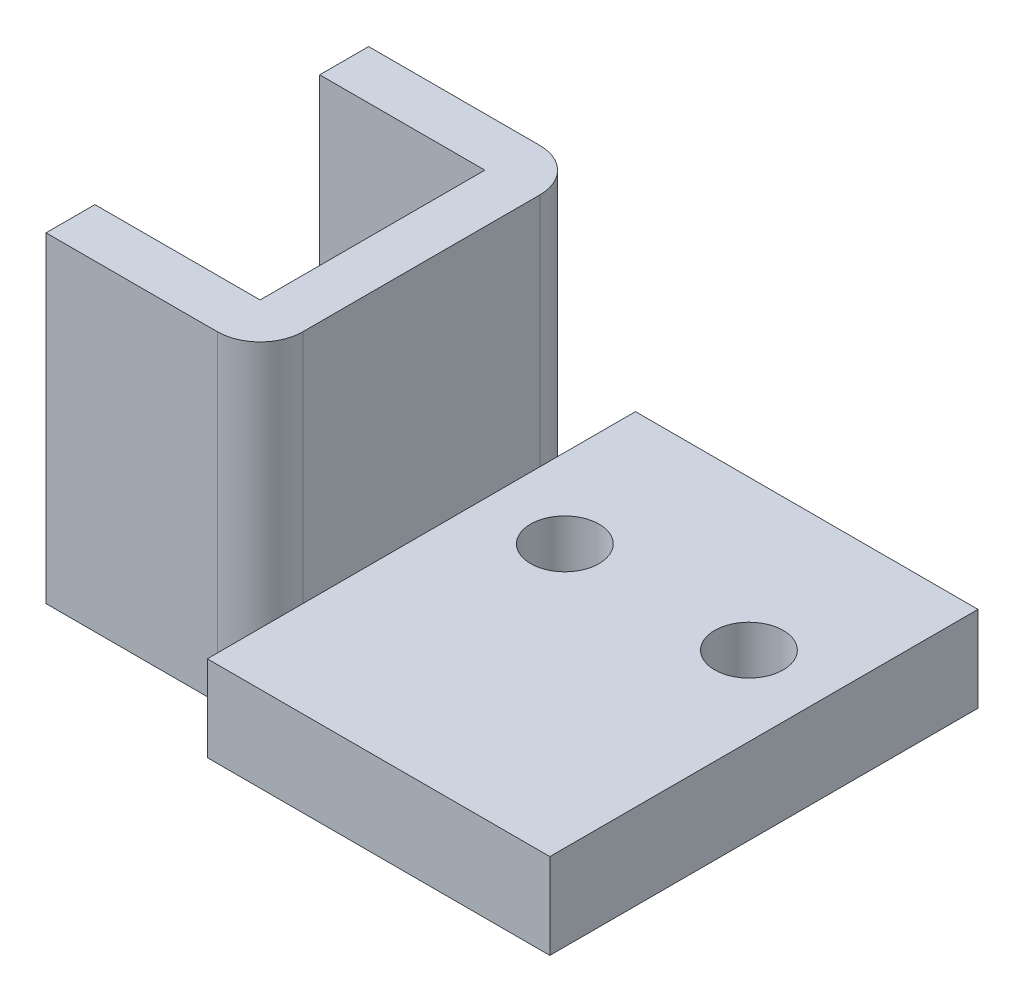
ISO-10303-21;
HEADER;
FILE_DESCRIPTION(('STEP AP214'),'2;1');
FILE_NAME('part.step','',(''),(''),'','','');
FILE_SCHEMA(('AUTOMOTIVE_DESIGN { 1 0 10303 214 1 1 1 1 }'));
ENDSEC;
DATA;
#1=APPLICATION_CONTEXT('core data for automotive mechanical design processes');
#2=APPLICATION_PROTOCOL_DEFINITION('international standard','automotive_design',2000,#1);
#3=PRODUCT_CONTEXT('',#1,'mechanical');
#4=PRODUCT('Part','Part','',(#3));
#5=PRODUCT_RELATED_PRODUCT_CATEGORY('part','',(#4));
#6=PRODUCT_DEFINITION_FORMATION('','',#4);
#7=PRODUCT_DEFINITION_CONTEXT('part definition',#1,'design');
#8=PRODUCT_DEFINITION('design','',#6,#7);
#9=PRODUCT_DEFINITION_SHAPE('','',#8);
#10=(LENGTH_UNIT() NAMED_UNIT(*) SI_UNIT(.MILLI.,.METRE.));
#11=(NAMED_UNIT(*) PLANE_ANGLE_UNIT() SI_UNIT($,.RADIAN.));
#12=(NAMED_UNIT(*) SI_UNIT($,.STERADIAN.) SOLID_ANGLE_UNIT());
#13=UNCERTAINTY_MEASURE_WITH_UNIT(LENGTH_MEASURE(1.E-05),#10,'distance_accuracy_value','');
#14=(GEOMETRIC_REPRESENTATION_CONTEXT(3) GLOBAL_UNCERTAINTY_ASSIGNED_CONTEXT((#13)) GLOBAL_UNIT_ASSIGNED_CONTEXT((#10,
#11,#12)) REPRESENTATION_CONTEXT('',''));
#15=CARTESIAN_POINT('',(0.,0.,0.));
#16=DIRECTION('',(0.,0.,1.));
#17=DIRECTION('',(1.,0.,0.));
#18=AXIS2_PLACEMENT_3D('',#15,#16,#17);
#19=CARTESIAN_POINT('',(3.61645179689281,15.,0.));
#20=DIRECTION('',(-1.,0.,0.));
#21=DIRECTION('',(0.,0.,1.));
#22=AXIS2_PLACEMENT_3D('',#19,#20,#21);
#23=PLANE('',#22);
#24=DIRECTION('',(0.,-1.,0.));
#25=VECTOR('',#24,1.);
#26=CARTESIAN_POINT('',(3.61645179689281,15.,1.20931638920193));
#27=LINE('',#26,#25);
#28=CARTESIAN_POINT('',(3.61645179689281,15.,1.20931638920193));
#29=VERTEX_POINT('',#28);
#30=CARTESIAN_POINT('',(3.61645179689281,4.,1.20931638920193));
#31=VERTEX_POINT('',#30);
#32=EDGE_CURVE('E221',#29,#31,#27,.T.);
#33=ORIENTED_EDGE('',*,*,#32,.T.);
#34=DIRECTION('',(0.,0.,1.));
#35=VECTOR('',#34,1.);
#36=CARTESIAN_POINT('',(3.61645179689282,4.,0.));
#37=LINE('',#36,#35);
#38=CARTESIAN_POINT('',(3.61645179689281,4.,-9.86068361079804));
#39=VERTEX_POINT('',#38);
#40=EDGE_CURVE('E56',#39,#31,#37,.T.);
#41=ORIENTED_EDGE('',*,*,#40,.F.);
#42=DIRECTION('',(0.,-1.,0.));
#43=VECTOR('',#42,1.);
#44=CARTESIAN_POINT('',(3.61645179689281,15.,-9.86068361079804));
#45=LINE('',#44,#43);
#46=CARTESIAN_POINT('',(3.61645179689281,15.,-9.86068361079804));
#47=VERTEX_POINT('',#46);
#48=EDGE_CURVE('E11',#47,#39,#45,.T.);
#49=ORIENTED_EDGE('',*,*,#48,.F.);
#50=DIRECTION('',(0.,0.,-1.));
#51=VECTOR('',#50,1.);
#52=CARTESIAN_POINT('',(3.61645179689281,15.,0.));
#53=LINE('',#52,#51);
#54=EDGE_CURVE('E191',#29,#47,#53,.T.);
#55=ORIENTED_EDGE('',*,*,#54,.F.);
#56=EDGE_LOOP('',(#33,#41,#49,#55));
#57=FACE_BOUND('',#56,.T.);
#58=ADVANCED_FACE('F41',(#57),#23,.F.);
#59=CARTESIAN_POINT('',(1.61645179689281,15.,-9.86068361079806));
#60=DIRECTION('',(0.,-1.,0.));
#61=DIRECTION('',(0.,0.,-1.));
#62=AXIS2_PLACEMENT_3D('',#59,#60,#61);
#63=CYLINDRICAL_SURFACE('',#62,2.);
#64=CARTESIAN_POINT('',(1.61645179689281,0.,-9.86068361079806));
#65=DIRECTION('',(0.,1.,0.));
#66=DIRECTION('',(0.,0.,1.));
#67=AXIS2_PLACEMENT_3D('',#64,#65,#66);
#68=CIRCLE('',#67,2.);
#69=CARTESIAN_POINT('',(3.61645179689282,0.,-9.86068361079804));
#70=VERTEX_POINT('',#69);
#71=CARTESIAN_POINT('',(1.6164517968928,0.,-11.8606836107981));
#72=VERTEX_POINT('',#71);
#73=EDGE_CURVE('E190',#70,#72,#68,.T.);
#74=ORIENTED_EDGE('',*,*,#73,.T.);
#75=DIRECTION('',(0.,-1.,0.));
#76=VECTOR('',#75,1.);
#77=CARTESIAN_POINT('',(1.6164517968928,15.,-11.8606836107981));
#78=LINE('',#77,#76);
#79=CARTESIAN_POINT('',(1.6164517968928,15.,-11.8606836107981));
#80=VERTEX_POINT('',#79);
#81=EDGE_CURVE('E49',#80,#72,#78,.T.);
#82=ORIENTED_EDGE('',*,*,#81,.F.);
#83=CARTESIAN_POINT('',(1.61645179689281,15.,-9.86068361079806));
#84=DIRECTION('',(0.,1.,0.));
#85=DIRECTION('',(0.,0.,1.));
#86=AXIS2_PLACEMENT_3D('',#83,#84,#85);
#87=CIRCLE('',#86,2.);
#88=EDGE_CURVE('E195',#47,#80,#87,.T.);
#89=ORIENTED_EDGE('',*,*,#88,.F.);
#90=ORIENTED_EDGE('',*,*,#48,.T.);
#91=DIRECTION('',(0.,-1.,0.));
#92=VECTOR('',#91,1.);
#93=CARTESIAN_POINT('',(3.61645179689281,15.,-9.86068361079806));
#94=LINE('',#93,#92);
#95=EDGE_CURVE('E181',#39,#70,#94,.T.);
#96=ORIENTED_EDGE('',*,*,#95,.T.);
#97=EDGE_LOOP('',(#74,#82,#89,#90,#96));
#98=FACE_BOUND('',#97,.T.);
#99=ADVANCED_FACE('F302',(#98),#63,.T.);
#100=CARTESIAN_POINT('',(0.,15.,-11.8606836107981));
#101=DIRECTION('',(0.,0.,1.));
#102=DIRECTION('',(1.,0.,0.));
#103=AXIS2_PLACEMENT_3D('',#100,#101,#102);
#104=PLANE('',#103);
#105=DIRECTION('',(-1.,0.,0.));
#106=VECTOR('',#105,1.);
#107=CARTESIAN_POINT('',(0.,0.,-11.8606836107981));
#108=LINE('',#107,#106);
#109=CARTESIAN_POINT('',(-6.38354820310719,0.,-11.8606836107981));
#110=VERTEX_POINT('',#109);
#111=EDGE_CURVE('E224',#72,#110,#108,.T.);
#112=ORIENTED_EDGE('',*,*,#111,.T.);
#113=DIRECTION('',(0.,-1.,0.));
#114=VECTOR('',#113,1.);
#115=CARTESIAN_POINT('',(-6.38354820310719,15.,-11.8606836107981));
#116=LINE('',#115,#114);
#117=CARTESIAN_POINT('',(-6.38354820310719,15.,-11.8606836107981));
#118=VERTEX_POINT('',#117);
#119=EDGE_CURVE('E271',#118,#110,#116,.T.);
#120=ORIENTED_EDGE('',*,*,#119,.F.);
#121=DIRECTION('',(-1.,0.,0.));
#122=VECTOR('',#121,1.);
#123=CARTESIAN_POINT('',(0.,15.,-11.8606836107981));
#124=LINE('',#123,#122);
#125=EDGE_CURVE('E199',#80,#118,#124,.T.);
#126=ORIENTED_EDGE('',*,*,#125,.F.);
#127=ORIENTED_EDGE('',*,*,#81,.T.);
#128=EDGE_LOOP('',(#112,#120,#126,#127));
#129=FACE_BOUND('',#128,.T.);
#130=ADVANCED_FACE('F280',(#129),#104,.F.);
#131=CARTESIAN_POINT('',(-6.38354820310719,15.,0.));
#132=DIRECTION('',(1.,0.,0.));
#133=DIRECTION('',(0.,0.,-1.));
#134=AXIS2_PLACEMENT_3D('',#131,#132,#133);
#135=PLANE('',#134);
#136=DIRECTION('',(0.,0.,1.));
#137=VECTOR('',#136,1.);
#138=CARTESIAN_POINT('',(-6.38354820310719,0.,0.));
#139=LINE('',#138,#137);
#140=CARTESIAN_POINT('',(-6.38354820310719,0.,-9.57568361079805));
#141=VERTEX_POINT('',#140);
#142=EDGE_CURVE('E227',#110,#141,#139,.T.);
#143=ORIENTED_EDGE('',*,*,#142,.T.);
#144=DIRECTION('',(0.,-1.,0.));
#145=VECTOR('',#144,1.);
#146=CARTESIAN_POINT('',(-6.38354820310719,15.,-9.57568361079805));
#147=LINE('',#146,#145);
#148=CARTESIAN_POINT('',(-6.38354820310719,15.,-9.57568361079805));
#149=VERTEX_POINT('',#148);
#150=EDGE_CURVE('E267',#149,#141,#147,.T.);
#151=ORIENTED_EDGE('',*,*,#150,.F.);
#152=DIRECTION('',(0.,0.,1.));
#153=VECTOR('',#152,1.);
#154=CARTESIAN_POINT('',(-6.38354820310719,15.,0.));
#155=LINE('',#154,#153);
#156=EDGE_CURVE('E202',#118,#149,#155,.T.);
#157=ORIENTED_EDGE('',*,*,#156,.F.);
#158=ORIENTED_EDGE('',*,*,#119,.T.);
#159=EDGE_LOOP('',(#143,#151,#157,#158));
#160=FACE_BOUND('',#159,.T.);
#161=ADVANCED_FACE('F291',(#160),#135,.F.);
#162=CARTESIAN_POINT('',(0.,15.,-9.57568361079805));
#163=DIRECTION('',(0.,0.,-1.));
#164=DIRECTION('',(-1.,0.,0.));
#165=AXIS2_PLACEMENT_3D('',#162,#163,#164);
#166=PLANE('',#165);
#167=DIRECTION('',(1.,0.,0.));
#168=VECTOR('',#167,1.);
#169=CARTESIAN_POINT('',(0.,0.,-9.57568361079805));
#170=LINE('',#169,#168);
#171=CARTESIAN_POINT('',(1.3314517968928,0.,-9.57568361079805));
#172=VERTEX_POINT('',#171);
#173=EDGE_CURVE('E230',#141,#172,#170,.T.);
#174=ORIENTED_EDGE('',*,*,#173,.T.);
#175=DIRECTION('',(0.,-1.,0.));
#176=VECTOR('',#175,1.);
#177=CARTESIAN_POINT('',(1.3314517968928,15.,-9.57568361079805));
#178=LINE('',#177,#176);
#179=CARTESIAN_POINT('',(1.3314517968928,15.,-9.57568361079805));
#180=VERTEX_POINT('',#179);
#181=EDGE_CURVE('E263',#180,#172,#178,.T.);
#182=ORIENTED_EDGE('',*,*,#181,.F.);
#183=DIRECTION('',(1.,0.,0.));
#184=VECTOR('',#183,1.);
#185=CARTESIAN_POINT('',(0.,15.,-9.57568361079805));
#186=LINE('',#185,#184);
#187=EDGE_CURVE('E205',#149,#180,#186,.T.);
#188=ORIENTED_EDGE('',*,*,#187,.F.);
#189=ORIENTED_EDGE('',*,*,#150,.T.);
#190=EDGE_LOOP('',(#174,#182,#188,#189));
#191=FACE_BOUND('',#190,.T.);
#192=ADVANCED_FACE('F295',(#191),#166,.F.);
#193=CARTESIAN_POINT('',(1.3314517968928,15.,0.));
#194=DIRECTION('',(1.,0.,0.));
#195=DIRECTION('',(0.,0.,-1.));
#196=AXIS2_PLACEMENT_3D('',#193,#194,#195);
#197=PLANE('',#196);
#198=DIRECTION('',(0.,0.,1.));
#199=VECTOR('',#198,1.);
#200=CARTESIAN_POINT('',(1.3314517968928,0.,0.));
#201=LINE('',#200,#199);
#202=CARTESIAN_POINT('',(1.3314517968928,0.,0.924316389201944));
#203=VERTEX_POINT('',#202);
#204=EDGE_CURVE('E234',#172,#203,#201,.T.);
#205=ORIENTED_EDGE('',*,*,#204,.T.);
#206=DIRECTION('',(0.,-1.,0.));
#207=VECTOR('',#206,1.);
#208=CARTESIAN_POINT('',(1.3314517968928,15.,0.924316389201944));
#209=LINE('',#208,#207);
#210=CARTESIAN_POINT('',(1.3314517968928,15.,0.924316389201944));
#211=VERTEX_POINT('',#210);
#212=EDGE_CURVE('E259',#211,#203,#209,.T.);
#213=ORIENTED_EDGE('',*,*,#212,.F.);
#214=DIRECTION('',(0.,0.,1.));
#215=VECTOR('',#214,1.);
#216=CARTESIAN_POINT('',(1.3314517968928,15.,0.));
#217=LINE('',#216,#215);
#218=EDGE_CURVE('E209',#180,#211,#217,.T.);
#219=ORIENTED_EDGE('',*,*,#218,.F.);
#220=ORIENTED_EDGE('',*,*,#181,.T.);
#221=EDGE_LOOP('',(#205,#213,#219,#220));
#222=FACE_BOUND('',#221,.T.);
#223=ADVANCED_FACE('F398',(#222),#197,.F.);
#224=CARTESIAN_POINT('',(0.,15.,0.924316389201944));
#225=DIRECTION('',(0.,0.,1.));
#226=DIRECTION('',(1.,0.,0.));
#227=AXIS2_PLACEMENT_3D('',#224,#225,#226);
#228=PLANE('',#227);
#229=DIRECTION('',(-1.,0.,0.));
#230=VECTOR('',#229,1.);
#231=CARTESIAN_POINT('',(0.,0.,0.924316389201944));
#232=LINE('',#231,#230);
#233=CARTESIAN_POINT('',(-6.38354820310719,0.,0.924316389201945));
#234=VERTEX_POINT('',#233);
#235=EDGE_CURVE('E237',#203,#234,#232,.T.);
#236=ORIENTED_EDGE('',*,*,#235,.T.);
#237=DIRECTION('',(0.,-1.,0.));
#238=VECTOR('',#237,1.);
#239=CARTESIAN_POINT('',(-6.38354820310719,15.,0.924316389201945));
#240=LINE('',#239,#238);
#241=CARTESIAN_POINT('',(-6.38354820310719,15.,0.924316389201945));
#242=VERTEX_POINT('',#241);
#243=EDGE_CURVE('E255',#242,#234,#240,.T.);
#244=ORIENTED_EDGE('',*,*,#243,.F.);
#245=DIRECTION('',(-1.,0.,0.));
#246=VECTOR('',#245,1.);
#247=CARTESIAN_POINT('',(0.,15.,0.924316389201944));
#248=LINE('',#247,#246);
#249=EDGE_CURVE('E212',#211,#242,#248,.T.);
#250=ORIENTED_EDGE('',*,*,#249,.F.);
#251=ORIENTED_EDGE('',*,*,#212,.T.);
#252=EDGE_LOOP('',(#236,#244,#250,#251));
#253=FACE_BOUND('',#252,.T.);
#254=ADVANCED_FACE('F396',(#253),#228,.F.);
#255=CARTESIAN_POINT('',(-6.38354820310719,0.,3.20931638920194));
#256=VERTEX_POINT('',#255);
#257=EDGE_CURVE('E231',#234,#256,#139,.T.);
#258=ORIENTED_EDGE('',*,*,#257,.T.);
#259=DIRECTION('',(0.,-1.,0.));
#260=VECTOR('',#259,1.);
#261=CARTESIAN_POINT('',(-6.38354820310719,15.,3.20931638920194));
#262=LINE('',#261,#260);
#263=CARTESIAN_POINT('',(-6.38354820310719,15.,3.20931638920194));
#264=VERTEX_POINT('',#263);
#265=EDGE_CURVE('E251',#264,#256,#262,.T.);
#266=ORIENTED_EDGE('',*,*,#265,.F.);
#267=EDGE_CURVE('E206',#242,#264,#155,.T.);
#268=ORIENTED_EDGE('',*,*,#267,.F.);
#269=ORIENTED_EDGE('',*,*,#243,.T.);
#270=EDGE_LOOP('',(#258,#266,#268,#269));
#271=FACE_BOUND('',#270,.T.);
#272=ADVANCED_FACE('F392',(#271),#135,.F.);
#273=CARTESIAN_POINT('',(0.,15.,3.20931638920194));
#274=DIRECTION('',(0.,0.,-1.));
#275=DIRECTION('',(-1.,0.,0.));
#276=AXIS2_PLACEMENT_3D('',#273,#274,#275);
#277=PLANE('',#276);
#278=DIRECTION('',(1.,0.,0.));
#279=VECTOR('',#278,1.);
#280=CARTESIAN_POINT('',(0.,0.,3.20931638920194));
#281=LINE('',#280,#279);
#282=CARTESIAN_POINT('',(1.6164517968928,0.,3.20931638920194));
#283=VERTEX_POINT('',#282);
#284=EDGE_CURVE('E240',#256,#283,#281,.T.);
#285=ORIENTED_EDGE('',*,*,#284,.T.);
#286=DIRECTION('',(0.,-1.,0.));
#287=VECTOR('',#286,1.);
#288=CARTESIAN_POINT('',(1.6164517968928,15.,3.20931638920194));
#289=LINE('',#288,#287);
#290=CARTESIAN_POINT('',(1.6164517968928,15.,3.20931638920194));
#291=VERTEX_POINT('',#290);
#292=EDGE_CURVE('E247',#291,#283,#289,.T.);
#293=ORIENTED_EDGE('',*,*,#292,.F.);
#294=DIRECTION('',(1.,0.,0.));
#295=VECTOR('',#294,1.);
#296=CARTESIAN_POINT('',(0.,15.,3.20931638920194));
#297=LINE('',#296,#295);
#298=EDGE_CURVE('E215',#264,#291,#297,.T.);
#299=ORIENTED_EDGE('',*,*,#298,.F.);
#300=ORIENTED_EDGE('',*,*,#265,.T.);
#301=EDGE_LOOP('',(#285,#293,#299,#300));
#302=FACE_BOUND('',#301,.T.);
#303=ADVANCED_FACE('F384',(#302),#277,.F.);
#304=CARTESIAN_POINT('',(1.61645179689281,15.,1.20931638920194));
#305=DIRECTION('',(0.,-1.,0.));
#306=DIRECTION('',(0.,0.,-1.));
#307=AXIS2_PLACEMENT_3D('',#304,#305,#306);
#308=CYLINDRICAL_SURFACE('',#307,2.);
#309=CARTESIAN_POINT('',(1.61645179689281,0.,1.20931638920194));
#310=DIRECTION('',(0.,1.,0.));
#311=DIRECTION('',(0.,0.,1.));
#312=AXIS2_PLACEMENT_3D('',#309,#310,#311);
#313=CIRCLE('',#312,2.);
#314=CARTESIAN_POINT('',(3.61645179689281,0.,1.20931638920193));
#315=VERTEX_POINT('',#314);
#316=EDGE_CURVE('E196',#283,#315,#313,.T.);
#317=ORIENTED_EDGE('',*,*,#316,.T.);
#318=DIRECTION('',(0.,-1.,0.));
#319=VECTOR('',#318,1.);
#320=CARTESIAN_POINT('',(3.61645179689281,15.,1.20931638920194));
#321=LINE('',#320,#319);
#322=EDGE_CURVE('E63',#31,#315,#321,.T.);
#323=ORIENTED_EDGE('',*,*,#322,.F.);
#324=ORIENTED_EDGE('',*,*,#32,.F.);
#325=CARTESIAN_POINT('',(1.61645179689281,15.,1.20931638920194));
#326=DIRECTION('',(0.,1.,0.));
#327=DIRECTION('',(0.,0.,1.));
#328=AXIS2_PLACEMENT_3D('',#325,#326,#327);
#329=CIRCLE('',#328,2.);
#330=EDGE_CURVE('E218',#291,#29,#329,.T.);
#331=ORIENTED_EDGE('',*,*,#330,.F.);
#332=ORIENTED_EDGE('',*,*,#292,.T.);
#333=EDGE_LOOP('',(#317,#323,#324,#331,#332));
#334=FACE_BOUND('',#333,.T.);
#335=ADVANCED_FACE('F377',(#334),#308,.T.);
#336=CARTESIAN_POINT('',(0.,15.,0.));
#337=DIRECTION('',(0.,1.,0.));
#338=DIRECTION('',(0.,0.,1.));
#339=AXIS2_PLACEMENT_3D('',#336,#337,#338);
#340=PLANE('',#339);
#341=ORIENTED_EDGE('',*,*,#54,.T.);
#342=ORIENTED_EDGE('',*,*,#88,.T.);
#343=ORIENTED_EDGE('',*,*,#125,.T.);
#344=ORIENTED_EDGE('',*,*,#156,.T.);
#345=ORIENTED_EDGE('',*,*,#187,.T.);
#346=ORIENTED_EDGE('',*,*,#218,.T.);
#347=ORIENTED_EDGE('',*,*,#249,.T.);
#348=ORIENTED_EDGE('',*,*,#267,.T.);
#349=ORIENTED_EDGE('',*,*,#298,.T.);
#350=ORIENTED_EDGE('',*,*,#330,.T.);
#351=EDGE_LOOP('',(#341,#342,#343,#344,#345,#346,#347,#348,#349,#350));
#352=FACE_BOUND('',#351,.T.);
#353=ADVANCED_FACE('F299',(#352),#340,.T.);
#354=CARTESIAN_POINT('',(0.,0.,0.));
#355=DIRECTION('',(0.,1.,0.));
#356=DIRECTION('',(0.,0.,1.));
#357=AXIS2_PLACEMENT_3D('',#354,#355,#356);
#358=PLANE('',#357);
#359=CARTESIAN_POINT('',(7.31645179689282,0.,-7.32568361079806));
#360=DIRECTION('',(0.,1.,0.));
#361=DIRECTION('',(0.,0.,1.));
#362=AXIS2_PLACEMENT_3D('',#359,#360,#361);
#363=CIRCLE('',#362,1.6);
#364=CARTESIAN_POINT('',(7.31645179689282,0.,-5.72568361079806));
#365=VERTEX_POINT('',#364);
#366=EDGE_CURVE('E338',#365,#365,#363,.T.);
#367=ORIENTED_EDGE('',*,*,#366,.T.);
#368=EDGE_LOOP('',(#367));
#369=FACE_BOUND('',#368,.T.);
#370=CARTESIAN_POINT('',(15.9164517968928,0.,-7.32568361079806));
#371=DIRECTION('',(0.,1.,0.));
#372=DIRECTION('',(0.,0.,1.));
#373=AXIS2_PLACEMENT_3D('',#370,#371,#372);
#374=CIRCLE('',#373,1.6);
#375=CARTESIAN_POINT('',(15.9164517968928,0.,-5.72568361079806));
#376=VERTEX_POINT('',#375);
#377=EDGE_CURVE('E347',#376,#376,#374,.T.);
#378=ORIENTED_EDGE('',*,*,#377,.T.);
#379=EDGE_LOOP('',(#378));
#380=FACE_BOUND('',#379,.T.);
#381=ORIENTED_EDGE('',*,*,#73,.F.);
#382=DIRECTION('',(0.,0.,1.));
#383=VECTOR('',#382,1.);
#384=CARTESIAN_POINT('',(3.61645179689282,0.,0.));
#385=LINE('',#384,#383);
#386=CARTESIAN_POINT('',(3.61645179689282,0.,-14.3256836107981));
#387=VERTEX_POINT('',#386);
#388=EDGE_CURVE('E308',#387,#70,#385,.T.);
#389=ORIENTED_EDGE('',*,*,#388,.F.);
#390=DIRECTION('',(-1.,0.,0.));
#391=VECTOR('',#390,1.);
#392=CARTESIAN_POINT('',(0.,0.,-14.3256836107981));
#393=LINE('',#392,#391);
#394=CARTESIAN_POINT('',(19.6164517968928,0.,-14.3256836107981));
#395=VERTEX_POINT('',#394);
#396=EDGE_CURVE('E334',#395,#387,#393,.T.);
#397=ORIENTED_EDGE('',*,*,#396,.F.);
#398=DIRECTION('',(0.,0.,-1.));
#399=VECTOR('',#398,1.);
#400=CARTESIAN_POINT('',(19.6164517968928,0.,0.));
#401=LINE('',#400,#399);
#402=CARTESIAN_POINT('',(19.6164517968928,0.,5.67431638920194));
#403=VERTEX_POINT('',#402);
#404=EDGE_CURVE('E176',#403,#395,#401,.T.);
#405=ORIENTED_EDGE('',*,*,#404,.F.);
#406=DIRECTION('',(1.,0.,0.));
#407=VECTOR('',#406,1.);
#408=CARTESIAN_POINT('',(0.,0.,5.67431638920194));
#409=LINE('',#408,#407);
#410=CARTESIAN_POINT('',(3.61645179689282,0.,5.67431638920194));
#411=VERTEX_POINT('',#410);
#412=EDGE_CURVE('E172',#411,#403,#409,.T.);
#413=ORIENTED_EDGE('',*,*,#412,.F.);
#414=EDGE_CURVE('E322',#315,#411,#385,.T.);
#415=ORIENTED_EDGE('',*,*,#414,.F.);
#416=ORIENTED_EDGE('',*,*,#316,.F.);
#417=ORIENTED_EDGE('',*,*,#284,.F.);
#418=ORIENTED_EDGE('',*,*,#257,.F.);
#419=ORIENTED_EDGE('',*,*,#235,.F.);
#420=ORIENTED_EDGE('',*,*,#204,.F.);
#421=ORIENTED_EDGE('',*,*,#173,.F.);
#422=ORIENTED_EDGE('',*,*,#142,.F.);
#423=ORIENTED_EDGE('',*,*,#111,.F.);
#424=EDGE_LOOP('',(#381,#389,#397,#405,#413,#415,#416,#417,#418,#419,#420,#421,#422,#423));
#425=FACE_BOUND('',#424,.T.);
#426=ADVANCED_FACE('F285',(#369,#380,#425),#358,.F.);
#427=CARTESIAN_POINT('',(3.61645179689282,4.,0.));
#428=DIRECTION('',(1.,0.,0.));
#429=DIRECTION('',(0.,0.,-1.));
#430=AXIS2_PLACEMENT_3D('',#427,#428,#429);
#431=PLANE('',#430);
#432=CARTESIAN_POINT('',(3.61645179689282,4.,5.67431638920194));
#433=VERTEX_POINT('',#432);
#434=EDGE_CURVE('E161',#31,#433,#37,.T.);
#435=ORIENTED_EDGE('',*,*,#434,.F.);
#436=ORIENTED_EDGE('',*,*,#322,.T.);
#437=ORIENTED_EDGE('',*,*,#414,.T.);
#438=DIRECTION('',(0.,-1.,0.));
#439=VECTOR('',#438,1.);
#440=CARTESIAN_POINT('',(3.61645179689282,4.,5.67431638920194));
#441=LINE('',#440,#439);
#442=EDGE_CURVE('E183',#433,#411,#441,.T.);
#443=ORIENTED_EDGE('',*,*,#442,.F.);
#444=EDGE_LOOP('',(#435,#436,#437,#443));
#445=FACE_BOUND('',#444,.T.);
#446=ADVANCED_FACE('F320',(#445),#431,.F.);
#447=CARTESIAN_POINT('',(19.6164517968928,4.,0.));
#448=DIRECTION('',(-1.,0.,0.));
#449=DIRECTION('',(0.,0.,1.));
#450=AXIS2_PLACEMENT_3D('',#447,#448,#449);
#451=PLANE('',#450);
#452=ORIENTED_EDGE('',*,*,#404,.T.);
#453=DIRECTION('',(0.,-1.,0.));
#454=VECTOR('',#453,1.);
#455=CARTESIAN_POINT('',(19.6164517968928,4.,-14.3256836107981));
#456=LINE('',#455,#454);
#457=CARTESIAN_POINT('',(19.6164517968928,4.,-14.3256836107981));
#458=VERTEX_POINT('',#457);
#459=EDGE_CURVE('E153',#458,#395,#456,.T.);
#460=ORIENTED_EDGE('',*,*,#459,.F.);
#461=DIRECTION('',(0.,0.,-1.));
#462=VECTOR('',#461,1.);
#463=CARTESIAN_POINT('',(19.6164517968928,4.,0.));
#464=LINE('',#463,#462);
#465=CARTESIAN_POINT('',(19.6164517968928,4.,5.67431638920194));
#466=VERTEX_POINT('',#465);
#467=EDGE_CURVE('E162',#466,#458,#464,.T.);
#468=ORIENTED_EDGE('',*,*,#467,.F.);
#469=DIRECTION('',(0.,-1.,0.));
#470=VECTOR('',#469,1.);
#471=CARTESIAN_POINT('',(19.6164517968928,4.,5.67431638920194));
#472=LINE('',#471,#470);
#473=EDGE_CURVE('E313',#466,#403,#472,.T.);
#474=ORIENTED_EDGE('',*,*,#473,.T.);
#475=EDGE_LOOP('',(#452,#460,#468,#474));
#476=FACE_BOUND('',#475,.T.);
#477=ADVANCED_FACE('F174',(#476),#451,.F.);
#478=CARTESIAN_POINT('',(0.,4.,-14.3256836107981));
#479=DIRECTION('',(0.,0.,1.));
#480=DIRECTION('',(1.,0.,0.));
#481=AXIS2_PLACEMENT_3D('',#478,#479,#480);
#482=PLANE('',#481);
#483=ORIENTED_EDGE('',*,*,#396,.T.);
#484=DIRECTION('',(0.,-1.,0.));
#485=VECTOR('',#484,1.);
#486=CARTESIAN_POINT('',(3.61645179689282,4.,-14.3256836107981));
#487=LINE('',#486,#485);
#488=CARTESIAN_POINT('',(3.61645179689282,4.,-14.3256836107981));
#489=VERTEX_POINT('',#488);
#490=EDGE_CURVE('E156',#489,#387,#487,.T.);
#491=ORIENTED_EDGE('',*,*,#490,.F.);
#492=DIRECTION('',(-1.,0.,0.));
#493=VECTOR('',#492,1.);
#494=CARTESIAN_POINT('',(0.,4.,-14.3256836107981));
#495=LINE('',#494,#493);
#496=EDGE_CURVE('E149',#458,#489,#495,.T.);
#497=ORIENTED_EDGE('',*,*,#496,.F.);
#498=ORIENTED_EDGE('',*,*,#459,.T.);
#499=EDGE_LOOP('',(#483,#491,#497,#498));
#500=FACE_BOUND('',#499,.T.);
#501=ADVANCED_FACE('F151',(#500),#482,.F.);
#502=ORIENTED_EDGE('',*,*,#95,.F.);
#503=EDGE_CURVE('E307',#489,#39,#37,.T.);
#504=ORIENTED_EDGE('',*,*,#503,.F.);
#505=ORIENTED_EDGE('',*,*,#490,.T.);
#506=ORIENTED_EDGE('',*,*,#388,.T.);
#507=EDGE_LOOP('',(#502,#504,#505,#506));
#508=FACE_BOUND('',#507,.T.);
#509=ADVANCED_FACE('F306',(#508),#431,.F.);
#510=CARTESIAN_POINT('',(0.,4.,5.67431638920194));
#511=DIRECTION('',(0.,0.,-1.));
#512=DIRECTION('',(-1.,0.,0.));
#513=AXIS2_PLACEMENT_3D('',#510,#511,#512);
#514=PLANE('',#513);
#515=ORIENTED_EDGE('',*,*,#412,.T.);
#516=ORIENTED_EDGE('',*,*,#473,.F.);
#517=DIRECTION('',(1.,0.,0.));
#518=VECTOR('',#517,1.);
#519=CARTESIAN_POINT('',(0.,4.,5.67431638920194));
#520=LINE('',#519,#518);
#521=EDGE_CURVE('E167',#433,#466,#520,.T.);
#522=ORIENTED_EDGE('',*,*,#521,.F.);
#523=ORIENTED_EDGE('',*,*,#442,.T.);
#524=EDGE_LOOP('',(#515,#516,#522,#523));
#525=FACE_BOUND('',#524,.T.);
#526=ADVANCED_FACE('F326',(#525),#514,.F.);
#527=CARTESIAN_POINT('',(0.,4.,0.));
#528=DIRECTION('',(0.,1.,0.));
#529=DIRECTION('',(0.,0.,1.));
#530=AXIS2_PLACEMENT_3D('',#527,#528,#529);
#531=PLANE('',#530);
#532=CARTESIAN_POINT('',(7.31645179689282,4.,-7.32568361079806));
#533=DIRECTION('',(0.,1.,0.));
#534=DIRECTION('',(0.,0.,1.));
#535=AXIS2_PLACEMENT_3D('',#532,#533,#534);
#536=CIRCLE('',#535,1.6);
#537=CARTESIAN_POINT('',(7.31645179689282,4.,-5.72568361079806));
#538=VERTEX_POINT('',#537);
#539=EDGE_CURVE('E341',#538,#538,#536,.T.);
#540=ORIENTED_EDGE('',*,*,#539,.F.);
#541=EDGE_LOOP('',(#540));
#542=FACE_BOUND('',#541,.T.);
#543=CARTESIAN_POINT('',(15.9164517968928,4.,-7.32568361079806));
#544=DIRECTION('',(0.,1.,0.));
#545=DIRECTION('',(0.,0.,1.));
#546=AXIS2_PLACEMENT_3D('',#543,#544,#545);
#547=CIRCLE('',#546,1.6);
#548=CARTESIAN_POINT('',(15.9164517968928,4.,-5.72568361079806));
#549=VERTEX_POINT('',#548);
#550=EDGE_CURVE('E353',#549,#549,#547,.T.);
#551=ORIENTED_EDGE('',*,*,#550,.F.);
#552=EDGE_LOOP('',(#551));
#553=FACE_BOUND('',#552,.T.);
#554=ORIENTED_EDGE('',*,*,#467,.T.);
#555=ORIENTED_EDGE('',*,*,#496,.T.);
#556=ORIENTED_EDGE('',*,*,#503,.T.);
#557=ORIENTED_EDGE('',*,*,#40,.T.);
#558=ORIENTED_EDGE('',*,*,#434,.T.);
#559=ORIENTED_EDGE('',*,*,#521,.T.);
#560=EDGE_LOOP('',(#554,#555,#556,#557,#558,#559));
#561=FACE_BOUND('',#560,.T.);
#562=ADVANCED_FACE('F165',(#542,#553,#561),#531,.T.);
#563=CARTESIAN_POINT('',(15.9164517968928,0.,-7.32568361079806));
#564=DIRECTION('',(0.,1.,0.));
#565=DIRECTION('',(0.,0.,1.));
#566=AXIS2_PLACEMENT_3D('',#563,#564,#565);
#567=CYLINDRICAL_SURFACE('',#566,1.6);
#568=ORIENTED_EDGE('',*,*,#377,.F.);
#569=EDGE_LOOP('',(#568));
#570=FACE_BOUND('',#569,.T.);
#571=ORIENTED_EDGE('',*,*,#550,.T.);
#572=EDGE_LOOP('',(#571));
#573=FACE_BOUND('',#572,.T.);
#574=ADVANCED_FACE('F358',(#570,#573),#567,.F.);
#575=CARTESIAN_POINT('',(7.31645179689282,0.,-7.32568361079806));
#576=DIRECTION('',(0.,1.,0.));
#577=DIRECTION('',(0.,0.,1.));
#578=AXIS2_PLACEMENT_3D('',#575,#576,#577);
#579=CYLINDRICAL_SURFACE('',#578,1.6);
#580=ORIENTED_EDGE('',*,*,#366,.F.);
#581=EDGE_LOOP('',(#580));
#582=FACE_BOUND('',#581,.T.);
#583=ORIENTED_EDGE('',*,*,#539,.T.);
#584=EDGE_LOOP('',(#583));
#585=FACE_BOUND('',#584,.T.);
#586=ADVANCED_FACE('F367',(#582,#585),#579,.F.);
#587=CLOSED_SHELL('',(#58,#99,#130,#161,#192,#223,#254,#272,#303,#335,#353,#426,#446,#477,#501,
#509,#526,#562,#574,#586));
#588=MANIFOLD_SOLID_BREP('B2',#587);
#589=ADVANCED_BREP_SHAPE_REPRESENTATION('',(#18,#588),#14);
#590=SHAPE_DEFINITION_REPRESENTATION(#9,#589);
ENDSEC;
END-ISO-10303-21;
